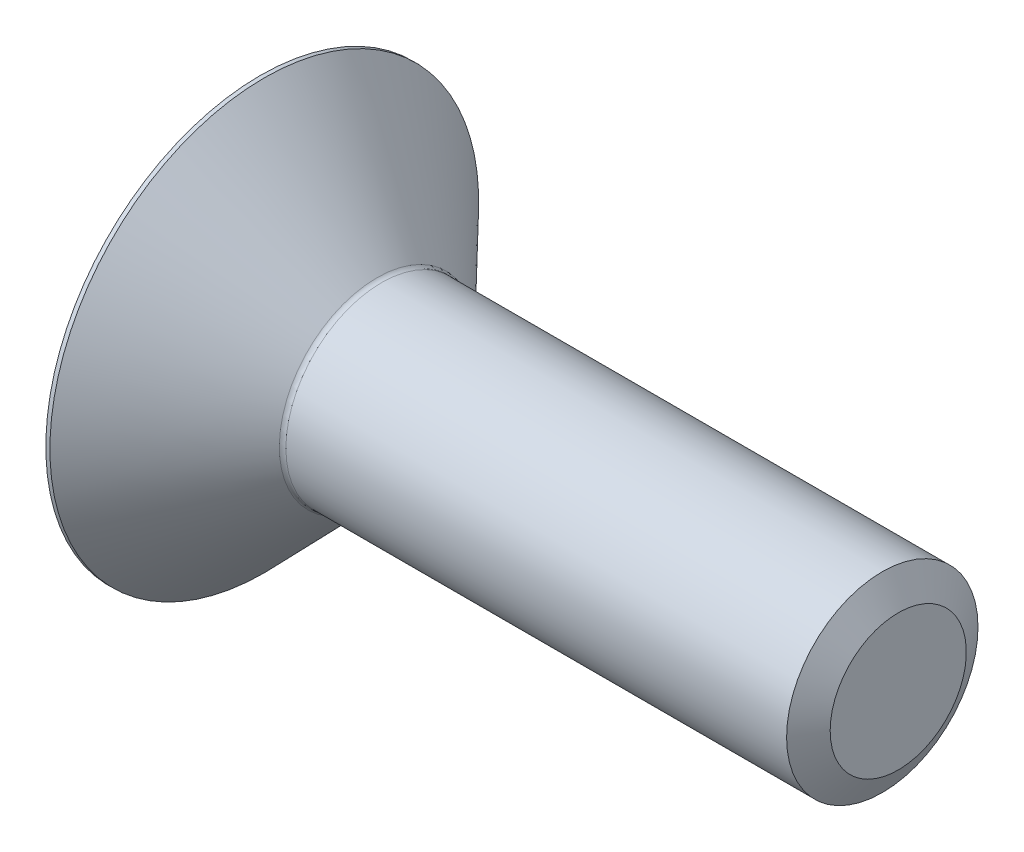
ISO-10303-21;
HEADER;
FILE_DESCRIPTION(('STEP AP214'),'2;1');
FILE_NAME('part.step','',(''),(''),'','','');
FILE_SCHEMA(('AUTOMOTIVE_DESIGN { 1 0 10303 214 1 1 1 1 }'));
ENDSEC;
DATA;
#1=APPLICATION_CONTEXT('core data for automotive mechanical design processes');
#2=APPLICATION_PROTOCOL_DEFINITION('international standard','automotive_design',2000,#1);
#3=PRODUCT_CONTEXT('',#1,'mechanical');
#4=PRODUCT('Part','Part','',(#3));
#5=PRODUCT_RELATED_PRODUCT_CATEGORY('part','',(#4));
#6=PRODUCT_DEFINITION_FORMATION('','',#4);
#7=PRODUCT_DEFINITION_CONTEXT('part definition',#1,'design');
#8=PRODUCT_DEFINITION('design','',#6,#7);
#9=PRODUCT_DEFINITION_SHAPE('','',#8);
#10=(LENGTH_UNIT() NAMED_UNIT(*) SI_UNIT(.MILLI.,.METRE.));
#11=(NAMED_UNIT(*) PLANE_ANGLE_UNIT() SI_UNIT($,.RADIAN.));
#12=(NAMED_UNIT(*) SI_UNIT($,.STERADIAN.) SOLID_ANGLE_UNIT());
#13=UNCERTAINTY_MEASURE_WITH_UNIT(LENGTH_MEASURE(1.E-05),#10,'distance_accuracy_value','');
#14=(GEOMETRIC_REPRESENTATION_CONTEXT(3) GLOBAL_UNCERTAINTY_ASSIGNED_CONTEXT((#13)) GLOBAL_UNIT_ASSIGNED_CONTEXT((#10,
#11,#12)) REPRESENTATION_CONTEXT('',''));
#15=CARTESIAN_POINT('',(0.,0.,0.));
#16=DIRECTION('',(0.,0.,1.));
#17=DIRECTION('',(1.,0.,0.));
#18=AXIS2_PLACEMENT_3D('',#15,#16,#17);
#19=CARTESIAN_POINT('',(0.,0.,0.));
#20=DIRECTION('',(1.,0.,0.));
#21=DIRECTION('',(0.,1.,0.));
#22=AXIS2_PLACEMENT_3D('',#19,#20,#21);
#23=CYLINDRICAL_SURFACE('',#22,1.5);
#24=CARTESIAN_POINT('',(-8.09755251837904,0.,0.));
#25=DIRECTION('',(1.,0.,0.));
#26=DIRECTION('',(0.,1.,0.));
#27=AXIS2_PLACEMENT_3D('',#24,#25,#26);
#28=CIRCLE('',#27,1.5);
#29=CARTESIAN_POINT('',(-8.09755251837904,1.5,0.));
#30=VERTEX_POINT('',#29);
#31=EDGE_CURVE('E102',#30,#30,#28,.T.);
#32=ORIENTED_EDGE('',*,*,#31,.T.);
#33=EDGE_LOOP('',(#32));
#34=FACE_BOUND('',#33,.T.);
#35=CARTESIAN_POINT('',(-0.25,0.,0.));
#36=DIRECTION('',(-1.,0.,0.));
#37=DIRECTION('',(0.,0.,1.));
#38=AXIS2_PLACEMENT_3D('',#35,#36,#37);
#39=CIRCLE('',#38,1.5);
#40=CARTESIAN_POINT('',(-0.25,0.,1.5));
#41=VERTEX_POINT('',#40);
#42=EDGE_CURVE('E92',#41,#41,#39,.T.);
#43=ORIENTED_EDGE('',*,*,#42,.T.);
#44=EDGE_LOOP('',(#43));
#45=FACE_BOUND('',#44,.T.);
#46=ADVANCED_FACE('F17',(#34,#45),#23,.T.);
#47=CARTESIAN_POINT('',(-10.,3.36,0.));
#48=DIRECTION('',(-1.,0.,0.));
#49=DIRECTION('',(0.,-1.,0.));
#50=AXIS2_PLACEMENT_3D('',#47,#48,#49);
#51=PLANE('',#50);
#52=CARTESIAN_POINT('',(-10.,0.,0.));
#53=DIRECTION('',(1.,0.,0.));
#54=DIRECTION('',(0.,1.,0.));
#55=AXIS2_PLACEMENT_3D('',#52,#53,#54);
#56=CIRCLE('',#55,3.36);
#57=CARTESIAN_POINT('',(-10.,3.36,0.));
#58=VERTEX_POINT('',#57);
#59=EDGE_CURVE('E198',#58,#58,#56,.T.);
#60=ORIENTED_EDGE('',*,*,#59,.F.);
#61=EDGE_LOOP('',(#60));
#62=FACE_BOUND('',#61,.T.);
#63=CARTESIAN_POINT('',(-10.,0.,0.));
#64=DIRECTION('',(-1.,0.,0.));
#65=DIRECTION('',(0.,-1.,0.));
#66=AXIS2_PLACEMENT_3D('',#63,#64,#65);
#67=CIRCLE('',#66,1.15470053837925);
#68=CARTESIAN_POINT('',(-10.,-0.577350269189631,1.));
#69=VERTEX_POINT('',#68);
#70=CARTESIAN_POINT('',(-10.,-1.15470053837925,0.));
#71=VERTEX_POINT('',#70);
#72=EDGE_CURVE('E21',#69,#71,#67,.F.);
#73=ORIENTED_EDGE('',*,*,#72,.T.);
#74=CARTESIAN_POINT('',(-10.,-0.577350269189631,-1.));
#75=VERTEX_POINT('',#74);
#76=EDGE_CURVE('E11',#71,#75,#67,.F.);
#77=ORIENTED_EDGE('',*,*,#76,.T.);
#78=CARTESIAN_POINT('',(-10.,0.577350269189625,-1.));
#79=VERTEX_POINT('',#78);
#80=EDGE_CURVE('E27',#75,#79,#67,.F.);
#81=ORIENTED_EDGE('',*,*,#80,.T.);
#82=CARTESIAN_POINT('',(-10.,1.15470053837925,0.));
#83=VERTEX_POINT('',#82);
#84=EDGE_CURVE('E93',#79,#83,#67,.F.);
#85=ORIENTED_EDGE('',*,*,#84,.T.);
#86=CARTESIAN_POINT('',(-10.,0.,0.));
#87=DIRECTION('',(-1.,0.,0.));
#88=DIRECTION('',(0.,0.,1.));
#89=AXIS2_PLACEMENT_3D('',#86,#87,#88);
#90=CIRCLE('',#89,1.15470053837925);
#91=CARTESIAN_POINT('',(-10.,0.577350269189628,1.));
#92=VERTEX_POINT('',#91);
#93=EDGE_CURVE('E76',#92,#83,#90,.T.);
#94=ORIENTED_EDGE('',*,*,#93,.F.);
#95=EDGE_CURVE('E83',#92,#69,#67,.F.);
#96=ORIENTED_EDGE('',*,*,#95,.T.);
#97=EDGE_LOOP('',(#73,#77,#81,#85,#94,#96));
#98=FACE_BOUND('',#97,.T.);
#99=ADVANCED_FACE('F95',(#62,#98),#51,.T.);
#100=CARTESIAN_POINT('',(0.,0.,0.));
#101=DIRECTION('',(1.,0.,0.));
#102=DIRECTION('',(0.,1.,0.));
#103=AXIS2_PLACEMENT_3D('',#100,#101,#102);
#104=CYLINDRICAL_SURFACE('',#103,3.36);
#105=ORIENTED_EDGE('',*,*,#59,.T.);
#106=EDGE_LOOP('',(#105));
#107=FACE_BOUND('',#106,.T.);
#108=CARTESIAN_POINT('',(-9.93618112114115,0.,0.));
#109=DIRECTION('',(1.,0.,0.));
#110=DIRECTION('',(0.,1.,0.));
#111=AXIS2_PLACEMENT_3D('',#108,#109,#110);
#112=CIRCLE('',#111,3.36);
#113=CARTESIAN_POINT('',(-9.93618112114115,3.36,0.));
#114=VERTEX_POINT('',#113);
#115=EDGE_CURVE('E196',#114,#114,#112,.T.);
#116=ORIENTED_EDGE('',*,*,#115,.F.);
#117=EDGE_LOOP('',(#116));
#118=FACE_BOUND('',#117,.T.);
#119=ADVANCED_FACE('F183',(#107,#118),#104,.T.);
#120=CARTESIAN_POINT('',(-8.16948649841291,0.,0.));
#121=DIRECTION('',(-1.,0.,0.));
#122=DIRECTION('',(0.,-1.,0.));
#123=AXIS2_PLACEMENT_3D('',#120,#121,#122);
#124=CONICAL_SURFACE('',#123,1.5305341629541,0.802851455917393);
#125=ORIENTED_EDGE('',*,*,#115,.T.);
#126=EDGE_LOOP('',(#125));
#127=FACE_BOUND('',#126,.T.);
#128=CARTESIAN_POINT('',(-8.16948649841291,0.,0.));
#129=DIRECTION('',(1.,0.,0.));
#130=DIRECTION('',(0.,1.,0.));
#131=AXIS2_PLACEMENT_3D('',#128,#129,#130);
#132=CIRCLE('',#131,1.5305341629541);
#133=CARTESIAN_POINT('',(-8.16948649841291,1.5305341629541,0.));
#134=VERTEX_POINT('',#133);
#135=EDGE_CURVE('E205',#134,#134,#132,.T.);
#136=ORIENTED_EDGE('',*,*,#135,.F.);
#137=EDGE_LOOP('',(#136));
#138=FACE_BOUND('',#137,.T.);
#139=ADVANCED_FACE('F177',(#127,#138),#124,.T.);
#140=CARTESIAN_POINT('',(-8.09755251837904,0.,0.));
#141=DIRECTION('',(1.,0.,0.));
#142=DIRECTION('',(0.,1.,0.));
#143=AXIS2_PLACEMENT_3D('',#140,#141,#142);
#144=TOROIDAL_SURFACE('',#143,1.6,0.1);
#145=ORIENTED_EDGE('',*,*,#135,.T.);
#146=EDGE_LOOP('',(#145));
#147=FACE_BOUND('',#146,.T.);
#148=ORIENTED_EDGE('',*,*,#31,.F.);
#149=EDGE_LOOP('',(#148));
#150=FACE_BOUND('',#149,.T.);
#151=ADVANCED_FACE('F175',(#147,#150),#144,.F.);
#152=CARTESIAN_POINT('',(-9.67,0.,0.));
#153=DIRECTION('',(-1.,0.,0.));
#154=DIRECTION('',(0.,0.,1.));
#155=AXIS2_PLACEMENT_3D('',#152,#153,#154);
#156=CONICAL_SURFACE('',#155,0.,1.2924281638629);
#157=CARTESIAN_POINT('',(-10.0000330049495,-0.577234799135789,1.0002));
#158=CARTESIAN_POINT('',(-9.9931767723132,-0.601209328784404,0.958674896561032));
#159=CARTESIAN_POINT('',(-9.986950249306,-0.625233209733957,0.917064314161421));
#160=CARTESIAN_POINT('',(-9.97600820198551,-0.673377505205147,0.83367594831071));
#161=CARTESIAN_POINT('',(-9.97129338172424,-0.697497959424798,0.791898096100636));
#162=CARTESIAN_POINT('',(-9.9636556441477,-0.745669161891495,0.70846312596663));
#163=CARTESIAN_POINT('',(-9.96072237456089,-0.769719488656233,0.66680673807147));
#164=CARTESIAN_POINT('',(-9.95678895886859,-0.817855017501817,0.58343355646172));
#165=CARTESIAN_POINT('',(-9.95578838324887,-0.841940210643128,0.54171677823086));
#166=CARTESIAN_POINT('',(-9.95578838324887,-0.890110596925751,0.458283221769139));
#167=CARTESIAN_POINT('',(-9.95678895886859,-0.914195790067062,0.416566443538279));
#168=CARTESIAN_POINT('',(-9.96072237456089,-0.962331318912646,0.333193261928529));
#169=CARTESIAN_POINT('',(-9.9636556441477,-0.986381645677384,0.29153687403337));
#170=CARTESIAN_POINT('',(-9.97129338172424,-1.03455284814408,0.208101903899364));
#171=CARTESIAN_POINT('',(-9.97600820198551,-1.05867330236373,0.166324051689289));
#172=CARTESIAN_POINT('',(-9.986950249306,-1.10681759783492,0.082935685838579));
#173=CARTESIAN_POINT('',(-9.9931767723132,-1.13084147878447,0.0413251034389674));
#174=CARTESIAN_POINT('',(-10.0000330049495,-1.15481600843309,-0.000200000000000344));
#175=B_SPLINE_CURVE_WITH_KNOTS('',3,(#157,#158,#159,#160,#161,#162,#163,#164,#165,#166,#167,
#168,#169,#170,#171,#172,#173,#174),.UNSPECIFIED.,.F.,.F.,(4,2,2,2,2,2,2,2,4),(0.,
0.145319064827824,0.290705711767534,0.435239252261502,0.579740668498363,0.724242084735224,
0.868775625229192,1.0141622721689,1.15948133699673),.UNSPECIFIED.);
#176=EDGE_CURVE('E109',#69,#71,#175,.T.);
#177=ORIENTED_EDGE('',*,*,#176,.T.);
#178=ORIENTED_EDGE('',*,*,#72,.F.);
#179=EDGE_LOOP('',(#177,#178));
#180=FACE_BOUND('',#179,.T.);
#181=ADVANCED_FACE('F178',(#180),#156,.F.);
#182=CARTESIAN_POINT('',(-10.1864201247989,-1.50507658562174,1.));
#183=CARTESIAN_POINT('',(-10.1756805338984,-1.45995191683151,1.));
#184=CARTESIAN_POINT('',(-10.1650772555009,-1.41479478404147,1.));
#185=CARTESIAN_POINT('',(-10.1442124650908,-1.32439927872502,1.));
#186=CARTESIAN_POINT('',(-10.1339509706694,-1.27916090214299,1.));
#187=CARTESIAN_POINT('',(-10.1037611048582,-1.14320091952673,1.));
#188=CARTESIAN_POINT('',(-10.0844526928259,-1.0523395057026,1.));
#189=CARTESIAN_POINT('',(-10.0485427680109,-0.871021733651419,1.));
#190=CARTESIAN_POINT('',(-10.0319160072656,-0.780570478060274,1.));
#191=CARTESIAN_POINT('',(-10.0024593897724,-0.599053834032337,1.));
#192=CARTESIAN_POINT('',(-9.98962864404706,-0.507988594500086,1.));
#193=CARTESIAN_POINT('',(-9.96943375174607,-0.32401701013366,1.));
#194=CARTESIAN_POINT('',(-9.96214218519738,-0.231102062710143,1.));
#195=CARTESIAN_POINT('',(-9.95667782512395,-0.0915430747170626,1.));
#196=CARTESIAN_POINT('',(-9.9557682159605,-0.0450005144934816,1.));
#197=CARTESIAN_POINT('',(-9.95580922979905,0.0480838901527621,1.));
#198=CARTESIAN_POINT('',(-9.9567598571057,0.0946257345735193,1.));
#199=CARTESIAN_POINT('',(-9.96235911230975,0.234573783926051,1.));
#200=CARTESIAN_POINT('',(-9.96977149970247,0.327875024932963,1.));
#201=CARTESIAN_POINT('',(-9.99036481799359,0.51386632785343,1.));
#202=CARTESIAN_POINT('',(-10.0035505473147,0.60655581613127,1.));
#203=CARTESIAN_POINT('',(-10.0343302733835,0.794559797027599,1.));
#204=CARTESIAN_POINT('',(-10.0520641733632,0.889850634542142,1.));
#205=CARTESIAN_POINT('',(-10.0901792888416,1.07990716554416,1.));
#206=CARTESIAN_POINT('',(-10.1105609899614,1.17467275936659,1.));
#207=CARTESIAN_POINT('',(-10.1530302070275,1.36384761434311,1.));
#208=CARTESIAN_POINT('',(-10.1751182493127,1.45825675605088,1.));
#209=CARTESIAN_POINT('',(-10.2204204884302,1.64680497415504,1.));
#210=CARTESIAN_POINT('',(-10.2436347126392,1.74094404392717,1.));
#211=CARTESIAN_POINT('',(-10.2904980732842,1.92768913293957,1.));
#212=CARTESIAN_POINT('',(-10.314136313184,2.02029789764918,1.));
#213=CARTESIAN_POINT('',(-10.3619465911489,2.20537976707471,1.));
#214=CARTESIAN_POINT('',(-10.3861186431025,2.2978528681941,1.));
#215=CARTESIAN_POINT('',(-10.4348136295748,2.48255351818147,1.));
#216=CARTESIAN_POINT('',(-10.4593359637595,2.57478122564271,1.));
#217=CARTESIAN_POINT('',(-10.5086763218414,2.75915354563859,1.));
#218=CARTESIAN_POINT('',(-10.5334943336762,2.8512981613992,1.));
#219=CARTESIAN_POINT('',(-10.5584153528749,2.94341459729474,1.));
#220=B_SPLINE_CURVE_WITH_KNOTS('',3,(#182,#183,#184,#185,#186,#187,#188,#189,#190,#191,#192,
#193,#194,#195,#196,#197,#198,#199,#200,#201,#202,#203,#204,#205,#206,#207,#208,#209,#210,#211,
#212,#213,#214,#215,#216,#217,#218,#219),.UNSPECIFIED.,.F.,.F.,(4,2,2,2,2,2,2,2,2,2,2,2,2,2,2,2,
2,2,4),(0.,0.139154753232827,0.278316657587891,0.55696460448012,0.832812881766319,
1.10859650773445,1.38793420964473,1.52755398880046,1.66717409104072,1.94769382621527,
2.22844715485888,2.519169414303,2.80994506926727,3.10081077796332,3.39168356097394,
3.67841536084619,3.96515462957441,4.25145053495921,4.53773480030589),.UNSPECIFIED.);
#221=EDGE_CURVE('E82',#92,#69,#220,.F.);
#222=ORIENTED_EDGE('',*,*,#221,.T.);
#223=ORIENTED_EDGE('',*,*,#95,.F.);
#224=EDGE_LOOP('',(#222,#223));
#225=FACE_BOUND('',#224,.T.);
#226=ADVANCED_FACE('F88',(#225),#156,.F.);
#227=CARTESIAN_POINT('',(-10.0000330049495,1.15481600843309,-0.000199999999999794));
#228=CARTESIAN_POINT('',(-9.9931767723132,1.13084147878447,0.041325103438968));
#229=CARTESIAN_POINT('',(-9.986950249306,1.10681759783492,0.0829356858385795));
#230=CARTESIAN_POINT('',(-9.97600820198551,1.05867330236373,0.16632405168929));
#231=CARTESIAN_POINT('',(-9.97129338172424,1.03455284814408,0.208101903899364));
#232=CARTESIAN_POINT('',(-9.9636556441477,0.986381645677382,0.29153687403337));
#233=CARTESIAN_POINT('',(-9.96072237456089,0.962331318912644,0.33319326192853));
#234=CARTESIAN_POINT('',(-9.95678895886859,0.91419579006706,0.416566443538279));
#235=CARTESIAN_POINT('',(-9.95578838324887,0.890110596925749,0.45828322176914));
#236=CARTESIAN_POINT('',(-9.95578838324887,0.841940210643127,0.54171677823086));
#237=CARTESIAN_POINT('',(-9.95678895886859,0.817855017501815,0.583433556461721));
#238=CARTESIAN_POINT('',(-9.96072237456089,0.769719488656231,0.66680673807147));
#239=CARTESIAN_POINT('',(-9.9636556441477,0.745669161891493,0.70846312596663));
#240=CARTESIAN_POINT('',(-9.97129338172424,0.697497959424796,0.791898096100636));
#241=CARTESIAN_POINT('',(-9.97600820198551,0.673377505205146,0.83367594831071));
#242=CARTESIAN_POINT('',(-9.986950249306,0.625233209733955,0.917064314161421));
#243=CARTESIAN_POINT('',(-9.9931767723132,0.601209328784402,0.958674896561032));
#244=CARTESIAN_POINT('',(-10.0000330049495,0.577234799135787,1.0002));
#245=B_SPLINE_CURVE_WITH_KNOTS('',3,(#227,#228,#229,#230,#231,#232,#233,#234,#235,#236,#237,
#238,#239,#240,#241,#242,#243,#244),.UNSPECIFIED.,.F.,.F.,(4,2,2,2,2,2,2,2,4),(0.,
0.145319064827824,0.290705711767533,0.435239252261501,0.579740668498363,0.724242084735224,
0.868775625229192,1.0141622721689,1.15948133699673),.UNSPECIFIED.);
#246=EDGE_CURVE('E71',#83,#92,#245,.T.);
#247=ORIENTED_EDGE('',*,*,#246,.T.);
#248=ORIENTED_EDGE('',*,*,#93,.T.);
#249=EDGE_LOOP('',(#247,#248));
#250=FACE_BOUND('',#249,.T.);
#251=ADVANCED_FACE('F72',(#250),#156,.F.);
#252=CARTESIAN_POINT('',(-10.0000330049495,0.577234799135787,-1.0002));
#253=CARTESIAN_POINT('',(-9.9931767723132,0.601209328784402,-0.958674896561032));
#254=CARTESIAN_POINT('',(-9.986950249306,0.625233209733954,-0.917064314161421));
#255=CARTESIAN_POINT('',(-9.97600820198551,0.673377505205145,-0.83367594831071));
#256=CARTESIAN_POINT('',(-9.97129338172424,0.697497959424796,-0.791898096100636));
#257=CARTESIAN_POINT('',(-9.9636556441477,0.745669161891492,-0.70846312596663));
#258=CARTESIAN_POINT('',(-9.96072237456089,0.76971948865623,-0.66680673807147));
#259=CARTESIAN_POINT('',(-9.95678895886859,0.817855017501815,-0.58343355646172));
#260=CARTESIAN_POINT('',(-9.95578838324887,0.841940210643126,-0.54171677823086));
#261=CARTESIAN_POINT('',(-9.95578838324887,0.890110596925748,-0.458283221769139));
#262=CARTESIAN_POINT('',(-9.95678895886859,0.914195790067059,-0.416566443538279));
#263=CARTESIAN_POINT('',(-9.96072237456089,0.962331318912644,-0.33319326192853));
#264=CARTESIAN_POINT('',(-9.9636556441477,0.986381645677382,-0.29153687403337));
#265=CARTESIAN_POINT('',(-9.97129338172424,1.03455284814408,-0.208101903899364));
#266=CARTESIAN_POINT('',(-9.97600820198551,1.05867330236373,-0.166324051689289));
#267=CARTESIAN_POINT('',(-9.986950249306,1.10681759783492,-0.0829356858385789));
#268=CARTESIAN_POINT('',(-9.9931767723132,1.13084147878447,-0.0413251034389675));
#269=CARTESIAN_POINT('',(-10.0000330049495,1.15481600843309,0.000199999999999984));
#270=B_SPLINE_CURVE_WITH_KNOTS('',3,(#252,#253,#254,#255,#256,#257,#258,#259,#260,#261,#262,
#263,#264,#265,#266,#267,#268,#269),.UNSPECIFIED.,.F.,.F.,(4,2,2,2,2,2,2,2,4),(0.,
0.145319064827824,0.290705711767533,0.435239252261502,0.579740668498363,0.724242084735224,
0.868775625229192,1.0141622721689,1.15948133699673),.UNSPECIFIED.);
#271=EDGE_CURVE('E94',#79,#83,#270,.T.);
#272=ORIENTED_EDGE('',*,*,#271,.T.);
#273=ORIENTED_EDGE('',*,*,#84,.F.);
#274=EDGE_LOOP('',(#272,#273));
#275=FACE_BOUND('',#274,.T.);
#276=ADVANCED_FACE('F276',(#275),#156,.F.);
#277=CARTESIAN_POINT('',(-10.1864201247989,-1.50507658562174,-1.));
#278=CARTESIAN_POINT('',(-10.1756805338984,-1.45995191683151,-1.));
#279=CARTESIAN_POINT('',(-10.1650772555009,-1.41479478404147,-1.));
#280=CARTESIAN_POINT('',(-10.1442124650908,-1.32439927872502,-1.));
#281=CARTESIAN_POINT('',(-10.1339509706694,-1.27916090214299,-1.));
#282=CARTESIAN_POINT('',(-10.1037611048582,-1.14320091952673,-1.));
#283=CARTESIAN_POINT('',(-10.0844526928259,-1.0523395057026,-1.));
#284=CARTESIAN_POINT('',(-10.0485427680109,-0.871021733651419,-1.));
#285=CARTESIAN_POINT('',(-10.0319160072656,-0.780570478060274,-1.));
#286=CARTESIAN_POINT('',(-10.0024593897724,-0.599053834032337,-1.));
#287=CARTESIAN_POINT('',(-9.98962864404706,-0.507988594500086,-1.));
#288=CARTESIAN_POINT('',(-9.96943375174607,-0.32401701013366,-1.));
#289=CARTESIAN_POINT('',(-9.96214218519738,-0.231102062710143,-1.));
#290=CARTESIAN_POINT('',(-9.95667782512395,-0.0915430747170626,-1.));
#291=CARTESIAN_POINT('',(-9.9557682159605,-0.0450005144934816,-1.));
#292=CARTESIAN_POINT('',(-9.95580922979905,0.0480838901527621,-1.));
#293=CARTESIAN_POINT('',(-9.9567598571057,0.0946257345735193,-1.));
#294=CARTESIAN_POINT('',(-9.96235911230975,0.234573783926051,-1.));
#295=CARTESIAN_POINT('',(-9.96977149970247,0.327875024932963,-1.));
#296=CARTESIAN_POINT('',(-9.99036481799359,0.51386632785343,-1.));
#297=CARTESIAN_POINT('',(-10.0035505473147,0.60655581613127,-1.));
#298=CARTESIAN_POINT('',(-10.0343302733835,0.794559797027599,-1.));
#299=CARTESIAN_POINT('',(-10.0520641733632,0.889850634542142,-1.));
#300=CARTESIAN_POINT('',(-10.0901792888416,1.07990716554416,-1.));
#301=CARTESIAN_POINT('',(-10.1105609899614,1.17467275936659,-1.));
#302=CARTESIAN_POINT('',(-10.1530302070275,1.36384761434311,-1.));
#303=CARTESIAN_POINT('',(-10.1751182493127,1.45825675605088,-1.));
#304=CARTESIAN_POINT('',(-10.2204204884302,1.64680497415504,-1.));
#305=CARTESIAN_POINT('',(-10.2436347126392,1.74094404392717,-1.));
#306=CARTESIAN_POINT('',(-10.2904980732842,1.92768913293957,-1.));
#307=CARTESIAN_POINT('',(-10.314136313184,2.02029789764918,-1.));
#308=CARTESIAN_POINT('',(-10.3619465911489,2.20537976707471,-1.));
#309=CARTESIAN_POINT('',(-10.3861186431025,2.2978528681941,-1.));
#310=CARTESIAN_POINT('',(-10.4348136295748,2.48255351818147,-1.));
#311=CARTESIAN_POINT('',(-10.4593359637595,2.57478122564271,-1.));
#312=CARTESIAN_POINT('',(-10.5086763218414,2.75915354563859,-1.));
#313=CARTESIAN_POINT('',(-10.5334943336762,2.8512981613992,-1.));
#314=CARTESIAN_POINT('',(-10.5584153528749,2.94341459729474,-1.));
#315=B_SPLINE_CURVE_WITH_KNOTS('',3,(#277,#278,#279,#280,#281,#282,#283,#284,#285,#286,#287,
#288,#289,#290,#291,#292,#293,#294,#295,#296,#297,#298,#299,#300,#301,#302,#303,#304,#305,#306,
#307,#308,#309,#310,#311,#312,#313,#314),.UNSPECIFIED.,.F.,.F.,(4,2,2,2,2,2,2,2,2,2,2,2,2,2,2,2,
2,2,4),(0.,0.139154753232827,0.278316657587891,0.55696460448012,0.832812881766319,
1.10859650773445,1.38793420964473,1.52755398880046,1.66717409104072,1.94769382621527,
2.22844715485888,2.519169414303,2.80994506926727,3.10081077796332,3.39168356097394,
3.67841536084619,3.96515462957441,4.25145053495921,4.53773480030589),.UNSPECIFIED.);
#316=EDGE_CURVE('E235',#75,#79,#315,.T.);
#317=ORIENTED_EDGE('',*,*,#316,.T.);
#318=ORIENTED_EDGE('',*,*,#80,.F.);
#319=EDGE_LOOP('',(#317,#318));
#320=FACE_BOUND('',#319,.T.);
#321=ADVANCED_FACE('F262',(#320),#156,.F.);
#322=CARTESIAN_POINT('',(-10.0000330049495,-1.15481600843309,0.000199999999999855));
#323=CARTESIAN_POINT('',(-9.9931767723132,-1.13084147878448,-0.0413251034389682));
#324=CARTESIAN_POINT('',(-9.986950249306,-1.10681759783492,-0.0829356858385799));
#325=CARTESIAN_POINT('',(-9.97600820198551,-1.05867330236373,-0.16632405168929));
#326=CARTESIAN_POINT('',(-9.97129338172424,-1.03455284814408,-0.208101903899364));
#327=CARTESIAN_POINT('',(-9.9636556441477,-0.986381645677385,-0.29153687403337));
#328=CARTESIAN_POINT('',(-9.96072237456089,-0.962331318912647,-0.33319326192853));
#329=CARTESIAN_POINT('',(-9.95678895886859,-0.914195790067063,-0.41656644353828));
#330=CARTESIAN_POINT('',(-9.95578838324887,-0.890110596925751,-0.45828322176914));
#331=CARTESIAN_POINT('',(-9.95578838324887,-0.841940210643129,-0.541716778230861));
#332=CARTESIAN_POINT('',(-9.95678895886859,-0.817855017501818,-0.583433556461721));
#333=CARTESIAN_POINT('',(-9.96072237456089,-0.769719488656233,-0.66680673807147));
#334=CARTESIAN_POINT('',(-9.9636556441477,-0.745669161891495,-0.70846312596663));
#335=CARTESIAN_POINT('',(-9.97129338172424,-0.697497959424799,-0.791898096100636));
#336=CARTESIAN_POINT('',(-9.97600820198551,-0.673377505205148,-0.83367594831071));
#337=CARTESIAN_POINT('',(-9.986950249306,-0.625233209733957,-0.917064314161421));
#338=CARTESIAN_POINT('',(-9.9931767723132,-0.601209328784404,-0.958674896561032));
#339=CARTESIAN_POINT('',(-10.0000330049495,-0.577234799135789,-1.0002));
#340=B_SPLINE_CURVE_WITH_KNOTS('',3,(#322,#323,#324,#325,#326,#327,#328,#329,#330,#331,#332,
#333,#334,#335,#336,#337,#338,#339),.UNSPECIFIED.,.F.,.F.,(4,2,2,2,2,2,2,2,4),(0.,
0.145319064827824,0.290705711767533,0.435239252261501,0.579740668498363,0.724242084735224,
0.868775625229192,1.0141622721689,1.15948133699673),.UNSPECIFIED.);
#341=EDGE_CURVE('E115',#71,#75,#340,.T.);
#342=ORIENTED_EDGE('',*,*,#341,.T.);
#343=ORIENTED_EDGE('',*,*,#76,.F.);
#344=EDGE_LOOP('',(#342,#343));
#345=FACE_BOUND('',#344,.T.);
#346=ADVANCED_FACE('F270',(#345),#156,.F.);
#347=CARTESIAN_POINT('',(-8.9,0.,0.));
#348=DIRECTION('',(-1.,0.,0.));
#349=DIRECTION('',(0.,0.,1.));
#350=AXIS2_PLACEMENT_3D('',#347,#348,#349);
#351=CONICAL_SURFACE('',#350,1.15470053837925,1.0471975511966);
#352=CARTESIAN_POINT('',(-8.23333333333334,0.,0.));
#353=VERTEX_POINT('',#352);
#354=VERTEX_LOOP('',#353);
#355=FACE_BOUND('',#354,.T.);
#356=CARTESIAN_POINT('',(-9.27183528873947,-1.49514512143373,1.));
#357=CARTESIAN_POINT('',(-9.25111502079343,-1.45196126115329,1.));
#358=CARTESIAN_POINT('',(-9.23061367234947,-1.40867282404236,1.));
#359=CARTESIAN_POINT('',(-9.1901634335246,-1.32182947914247,1.));
#360=CARTESIAN_POINT('',(-9.17021464256729,-1.27827452509755,1.));
#361=CARTESIAN_POINT('',(-9.11114515483649,-1.14662339890625,1.));
#362=CARTESIAN_POINT('',(-9.07305252653304,-1.05805724149108,1.));
#363=CARTESIAN_POINT('',(-9.00024582070058,-0.876833003172496,1.));
#364=CARTESIAN_POINT('',(-8.96564584045392,-0.784128452056496,1.));
#365=CARTESIAN_POINT('',(-8.90407347381846,-0.596331746532131,1.));
#366=CARTESIAN_POINT('',(-8.87708128484786,-0.501246505541257,1.));
#367=CARTESIAN_POINT('',(-8.84577577003502,-0.356699986452704,1.));
#368=CARTESIAN_POINT('',(-8.83687509854699,-0.30824416317171,1.));
#369=CARTESIAN_POINT('',(-8.82274243175691,-0.210788870695444,1.));
#370=CARTESIAN_POINT('',(-8.81751018853518,-0.161789438465743,1.));
#371=CARTESIAN_POINT('',(-8.81119898098177,-0.0641060489970672,1.));
#372=CARTESIAN_POINT('',(-8.81007100501111,-0.0154253461269781,1.));
#373=CARTESIAN_POINT('',(-8.81193297830514,0.0818553564032744,1.));
#374=CARTESIAN_POINT('',(-8.81492318255362,0.130455350879701,1.));
#375=CARTESIAN_POINT('',(-8.82711832172931,0.250369589613777,1.));
#376=CARTESIAN_POINT('',(-8.83860856098489,0.321451919115026,1.));
#377=CARTESIAN_POINT('',(-8.86824031739763,0.462229038490166,1.));
#378=CARTESIAN_POINT('',(-8.88638985094493,0.531922048861731,1.));
#379=CARTESIAN_POINT('',(-8.92786972268665,0.671415729806803,1.));
#380=CARTESIAN_POINT('',(-8.95130716830693,0.741183729418067,1.));
#381=CARTESIAN_POINT('',(-9.00156448824641,0.879438319396284,1.));
#382=CARTESIAN_POINT('',(-9.02838317523047,0.947925349932555,1.));
#383=CARTESIAN_POINT('',(-9.1000539154734,1.12214515906644,1.));
#384=CARTESIAN_POINT('',(-9.14657230519899,1.22718574040677,1.));
#385=CARTESIAN_POINT('',(-9.24287692224798,1.43575968104558,1.));
#386=CARTESIAN_POINT('',(-9.29266398782224,1.53929264533347,1.));
#387=CARTESIAN_POINT('',(-9.39433644453464,1.74546702338821,1.));
#388=CARTESIAN_POINT('',(-9.44622418186697,1.84810727553998,1.));
#389=CARTESIAN_POINT('',(-9.55133836883522,2.05270058021726,1.));
#390=CARTESIAN_POINT('',(-9.60456486267233,2.15465360991172,1.));
#391=CARTESIAN_POINT('',(-9.7068669169112,2.34846553091283,1.));
#392=CARTESIAN_POINT('',(-9.75585965896404,2.4403682316157,1.));
#393=CARTESIAN_POINT('',(-9.85440313282821,2.62387799005299,1.));
#394=CARTESIAN_POINT('',(-9.90395388528949,2.71548503668386,1.));
#395=CARTESIAN_POINT('',(-10.0033471076798,2.89823865557592,1.));
#396=CARTESIAN_POINT('',(-10.053188515041,2.98938580641154,1.));
#397=CARTESIAN_POINT('',(-10.1531957233761,3.17149583112621,1.));
#398=CARTESIAN_POINT('',(-10.2033615072371,3.26245871439934,1.));
#399=CARTESIAN_POINT('',(-10.253646212205,3.35335539208175,1.));
#400=B_SPLINE_CURVE_WITH_KNOTS('',3,(#356,#357,#358,#359,#360,#361,#362,#363,#364,#365,#366,
#367,#368,#369,#370,#371,#372,#373,#374,#375,#376,#377,#378,#379,#380,#381,#382,#383,#384,#385,
#386,#387,#388,#389,#390,#391,#392,#393,#394,#395,#396,#397,#398,#399),.UNSPECIFIED.,.F.,.F.,(4,
2,2,2,2,2,2,2,2,2,2,2,2,2,2,2,2,2,2,2,2,4),(0.,0.143690341820649,0.287406372566272,
0.576560332877488,0.873259488934025,1.16917907000005,1.31686338831956,1.46453772487642,
1.61044269221658,1.75635669390451,1.97192533331897,2.18775432802312,2.40842600301164,
2.62902040304934,2.97355048126457,3.31816926186282,3.6631841739513,4.00821049225241,
4.32064609598595,4.63309330006987,4.94474578248759,5.2563819552864),.UNSPECIFIED.);
#401=CARTESIAN_POINT('',(-8.9,-0.577350269189627,1.));
#402=VERTEX_POINT('',#401);
#403=CARTESIAN_POINT('',(-8.9,0.577350269189625,1.));
#404=VERTEX_POINT('',#403);
#405=EDGE_CURVE('E145',#402,#404,#400,.T.);
#406=ORIENTED_EDGE('',*,*,#405,.T.);
#407=CARTESIAN_POINT('',(-8.90006667666567,0.577234799135787,1.0002));
#408=CARTESIAN_POINT('',(-8.88540897364915,0.602607795820546,0.95625268060172));
#409=CARTESIAN_POINT('',(-8.8720777236209,0.628199807531656,0.91192601605018));
#410=CARTESIAN_POINT('',(-8.84880650762346,0.67982709833083,0.822504925328879));
#411=CARTESIAN_POINT('',(-8.83887477654978,0.705863295614157,0.777408908798269));
#412=CARTESIAN_POINT('',(-8.82341269488208,0.757612978088367,0.687775829477381));
#413=CARTESIAN_POINT('',(-8.81777946809895,0.783318495222182,0.643252567766781));
#414=CARTESIAN_POINT('',(-8.81105128864025,0.83485064837367,0.553996260284983));
#415=CARTESIAN_POINT('',(-8.80995076792166,0.86067709674978,0.509263539518506));
#416=CARTESIAN_POINT('',(-8.81222505229814,0.908946264126689,0.425658889182654));
#417=CARTESIAN_POINT('',(-8.81504143886341,0.931396163287556,0.386774523211234));
#418=CARTESIAN_POINT('',(-8.82397245021735,0.976149681982092,0.309259155014814));
#419=CARTESIAN_POINT('',(-8.8300901337543,0.998453146411449,0.270628421438361));
#420=CARTESIAN_POINT('',(-8.84538572572582,1.04329913914046,0.192952883515855));
#421=CARTESIAN_POINT('',(-8.85462855216896,1.0658359836813,0.153917923728832));
#422=CARTESIAN_POINT('',(-8.87560684575553,1.11057330008463,0.0764306187239877));
#423=CARTESIAN_POINT('',(-8.88733737513366,1.13277434629517,0.0379772787061406));
#424=CARTESIAN_POINT('',(-8.90006667666567,1.15481600843309,-0.00019999999999974));
#425=B_SPLINE_CURVE_WITH_KNOTS('',3,(#407,#408,#409,#410,#411,#412,#413,#414,#415,#416,#417,
#418,#419,#420,#421,#422,#423,#424),.UNSPECIFIED.,.F.,.F.,(4,2,2,2,2,2,2,2,4),(0.,
0.158523820030115,0.317428970089343,0.472400167924634,0.627180939971649,0.762016584872711,
0.896977373984233,1.03493410168667,1.17261952416172),.UNSPECIFIED.);
#426=CARTESIAN_POINT('',(-8.9,1.15470053837925,0.));
#427=VERTEX_POINT('',#426);
#428=EDGE_CURVE('E101',#404,#427,#425,.T.);
#429=ORIENTED_EDGE('',*,*,#428,.T.);
#430=CARTESIAN_POINT('',(-8.90006667666567,1.15481600843309,0.000200000000000205));
#431=CARTESIAN_POINT('',(-8.88540897364915,1.12944301174833,-0.0437473193982794));
#432=CARTESIAN_POINT('',(-8.8720777236209,1.10385100003722,-0.0880739839498198));
#433=CARTESIAN_POINT('',(-8.84880650762345,1.05222370923805,-0.177495074671121));
#434=CARTESIAN_POINT('',(-8.83887477654978,1.02618751195472,-0.222591091201731));
#435=CARTESIAN_POINT('',(-8.82341269488208,0.974437829480509,-0.312224170522618));
#436=CARTESIAN_POINT('',(-8.81777946809895,0.948732312346693,-0.356747432233219));
#437=CARTESIAN_POINT('',(-8.81105128864025,0.897200159195205,-0.446003739715017));
#438=CARTESIAN_POINT('',(-8.80995076792166,0.871373710819096,-0.490736460481494));
#439=CARTESIAN_POINT('',(-8.81222505229814,0.823104543442187,-0.574341110817346));
#440=CARTESIAN_POINT('',(-8.81504143886341,0.800654644281319,-0.613225476788766));
#441=CARTESIAN_POINT('',(-8.82397245021735,0.755901125586783,-0.690740844985186));
#442=CARTESIAN_POINT('',(-8.8300901337543,0.733597661157425,-0.729371578561639));
#443=CARTESIAN_POINT('',(-8.84538572572582,0.688751668428418,-0.807047116484145));
#444=CARTESIAN_POINT('',(-8.85462855216896,0.666214823887574,-0.846082076271168));
#445=CARTESIAN_POINT('',(-8.87560684575553,0.621477507484248,-0.923569381276012));
#446=CARTESIAN_POINT('',(-8.88733737513366,0.599276461273704,-0.962022721293859));
#447=CARTESIAN_POINT('',(-8.90006667666567,0.577234799135787,-1.0002));
#448=B_SPLINE_CURVE_WITH_KNOTS('',3,(#430,#431,#432,#433,#434,#435,#436,#437,#438,#439,#440,
#441,#442,#443,#444,#445,#446,#447),.UNSPECIFIED.,.F.,.F.,(4,2,2,2,2,2,2,2,4),(0.,
0.158523820030116,0.317428970089343,0.472400167924634,0.627180939971649,0.762016584872712,
0.896977373984234,1.03493410168667,1.17261952416172),.UNSPECIFIED.);
#449=CARTESIAN_POINT('',(-8.9,0.577350269189626,-1.));
#450=VERTEX_POINT('',#449);
#451=EDGE_CURVE('E197',#427,#450,#448,.T.);
#452=ORIENTED_EDGE('',*,*,#451,.T.);
#453=CARTESIAN_POINT('',(-9.27183528873947,-1.49514512143373,-1.));
#454=CARTESIAN_POINT('',(-9.25111502079343,-1.45196126115329,-1.));
#455=CARTESIAN_POINT('',(-9.23061367234947,-1.40867282404236,-1.));
#456=CARTESIAN_POINT('',(-9.1901634335246,-1.32182947914247,-1.));
#457=CARTESIAN_POINT('',(-9.17021464256729,-1.27827452509755,-1.));
#458=CARTESIAN_POINT('',(-9.11114515483649,-1.14662339890625,-1.));
#459=CARTESIAN_POINT('',(-9.07305252653304,-1.05805724149108,-1.));
#460=CARTESIAN_POINT('',(-9.00024582070058,-0.876833003172495,-1.));
#461=CARTESIAN_POINT('',(-8.96564584045392,-0.784128452056495,-1.));
#462=CARTESIAN_POINT('',(-8.90407347381846,-0.596331746532131,-1.));
#463=CARTESIAN_POINT('',(-8.87708128484786,-0.501246505541256,-1.));
#464=CARTESIAN_POINT('',(-8.84577577003502,-0.356699986452704,-1.));
#465=CARTESIAN_POINT('',(-8.83687509854699,-0.30824416317171,-1.));
#466=CARTESIAN_POINT('',(-8.82274243175691,-0.210788870695444,-1.));
#467=CARTESIAN_POINT('',(-8.81751018853518,-0.161789438465743,-1.));
#468=CARTESIAN_POINT('',(-8.81119898098177,-0.0641060489970669,-1.));
#469=CARTESIAN_POINT('',(-8.81007100501111,-0.0154253461269777,-1.));
#470=CARTESIAN_POINT('',(-8.81193297830514,0.0818553564032746,-1.));
#471=CARTESIAN_POINT('',(-8.81492318255362,0.130455350879701,-1.));
#472=CARTESIAN_POINT('',(-8.82711832172931,0.250369589613777,-1.));
#473=CARTESIAN_POINT('',(-8.83860856098489,0.321451919115026,-1.));
#474=CARTESIAN_POINT('',(-8.86824031739763,0.462229038490166,-1.));
#475=CARTESIAN_POINT('',(-8.88638985094493,0.531922048861731,-1.));
#476=CARTESIAN_POINT('',(-8.92786972268665,0.671415729806803,-1.));
#477=CARTESIAN_POINT('',(-8.95130716830693,0.741183729418067,-1.));
#478=CARTESIAN_POINT('',(-9.00156448824641,0.879438319396284,-1.));
#479=CARTESIAN_POINT('',(-9.02838317523047,0.947925349932555,-1.));
#480=CARTESIAN_POINT('',(-9.1000539154734,1.12214515906644,-1.));
#481=CARTESIAN_POINT('',(-9.14657230519899,1.22718574040677,-1.));
#482=CARTESIAN_POINT('',(-9.24287692224798,1.43575968104557,-1.));
#483=CARTESIAN_POINT('',(-9.29266398782224,1.53929264533347,-1.));
#484=CARTESIAN_POINT('',(-9.39433644453464,1.74546702338821,-1.));
#485=CARTESIAN_POINT('',(-9.44622418186697,1.84810727553998,-1.));
#486=CARTESIAN_POINT('',(-9.55133836883522,2.05270058021726,-1.));
#487=CARTESIAN_POINT('',(-9.60456486267233,2.15465360991172,-1.));
#488=CARTESIAN_POINT('',(-9.7068669169112,2.34846553091283,-1.));
#489=CARTESIAN_POINT('',(-9.75585965896404,2.4403682316157,-1.));
#490=CARTESIAN_POINT('',(-9.85440313282821,2.623877990053,-1.));
#491=CARTESIAN_POINT('',(-9.90395388528949,2.71548503668386,-1.));
#492=CARTESIAN_POINT('',(-10.0033471076798,2.89823865557592,-1.));
#493=CARTESIAN_POINT('',(-10.053188515041,2.98938580641154,-1.));
#494=CARTESIAN_POINT('',(-10.1531957233761,3.17149583112621,-1.));
#495=CARTESIAN_POINT('',(-10.2033615072371,3.26245871439934,-1.));
#496=CARTESIAN_POINT('',(-10.253646212205,3.35335539208175,-1.));
#497=B_SPLINE_CURVE_WITH_KNOTS('',3,(#453,#454,#455,#456,#457,#458,#459,#460,#461,#462,#463,
#464,#465,#466,#467,#468,#469,#470,#471,#472,#473,#474,#475,#476,#477,#478,#479,#480,#481,#482,
#483,#484,#485,#486,#487,#488,#489,#490,#491,#492,#493,#494,#495,#496),.UNSPECIFIED.,.F.,.F.,(4,
2,2,2,2,2,2,2,2,2,2,2,2,2,2,2,2,2,2,2,2,4),(0.,0.143690341820649,0.287406372566272,
0.576560332877488,0.873259488934026,1.16917907000005,1.31686338831956,1.46453772487642,
1.61044269221658,1.75635669390451,1.97192533331897,2.18775432802312,2.40842600301164,
2.62902040304934,2.97355048126457,3.31816926186282,3.6631841739513,4.00821049225241,
4.32064609598595,4.63309330006987,4.9447457824876,5.2563819552864),.UNSPECIFIED.);
#498=CARTESIAN_POINT('',(-8.9,-0.577350269189627,-1.));
#499=VERTEX_POINT('',#498);
#500=EDGE_CURVE('E79',#450,#499,#497,.F.);
#501=ORIENTED_EDGE('',*,*,#500,.T.);
#502=CARTESIAN_POINT('',(-8.90006667666567,-0.577234799135789,-1.0002));
#503=CARTESIAN_POINT('',(-8.88540897364915,-0.602607795820548,-0.95625268060172));
#504=CARTESIAN_POINT('',(-8.8720777236209,-0.628199807531659,-0.91192601605018));
#505=CARTESIAN_POINT('',(-8.84880650762346,-0.679827098330832,-0.822504925328878));
#506=CARTESIAN_POINT('',(-8.83887477654978,-0.70586329561416,-0.777408908798268));
#507=CARTESIAN_POINT('',(-8.82341269488208,-0.757612978088369,-0.687775829477381));
#508=CARTESIAN_POINT('',(-8.81777946809895,-0.783318495222185,-0.64325256776678));
#509=CARTESIAN_POINT('',(-8.81105128864025,-0.834850648373673,-0.553996260284982));
#510=CARTESIAN_POINT('',(-8.80995076792166,-0.860677096749782,-0.509263539518505));
#511=CARTESIAN_POINT('',(-8.81222505229814,-0.908946264126691,-0.425658889182653));
#512=CARTESIAN_POINT('',(-8.81504143886341,-0.931396163287558,-0.386774523211233));
#513=CARTESIAN_POINT('',(-8.82397245021735,-0.976149681982094,-0.309259155014814));
#514=CARTESIAN_POINT('',(-8.8300901337543,-0.998453146411452,-0.270628421438361));
#515=CARTESIAN_POINT('',(-8.84538572572583,-1.04329913914046,-0.192952883515855));
#516=CARTESIAN_POINT('',(-8.85462855216896,-1.0658359836813,-0.153917923728832));
#517=CARTESIAN_POINT('',(-8.87560684575553,-1.11057330008463,-0.0764306187239879));
#518=CARTESIAN_POINT('',(-8.88733737513366,-1.13277434629517,-0.0379772787061409));
#519=CARTESIAN_POINT('',(-8.90006667666567,-1.15481600843309,0.000199999999999766));
#520=B_SPLINE_CURVE_WITH_KNOTS('',3,(#502,#503,#504,#505,#506,#507,#508,#509,#510,#511,#512,
#513,#514,#515,#516,#517,#518,#519),.UNSPECIFIED.,.F.,.F.,(4,2,2,2,2,2,2,2,4),(0.,
0.158523820030116,0.317428970089344,0.472400167924635,0.627180939971649,0.762016584872712,
0.896977373984233,1.03493410168667,1.17261952416172),.UNSPECIFIED.);
#521=CARTESIAN_POINT('',(-8.9,-1.15470053837925,0.));
#522=VERTEX_POINT('',#521);
#523=EDGE_CURVE('E246',#499,#522,#520,.T.);
#524=ORIENTED_EDGE('',*,*,#523,.T.);
#525=CARTESIAN_POINT('',(-8.90006667666567,-1.15481600843309,-0.00020000000000017));
#526=CARTESIAN_POINT('',(-8.88540897364915,-1.12944301174833,0.0437473193982795));
#527=CARTESIAN_POINT('',(-8.8720777236209,-1.10385100003722,0.0880739839498199));
#528=CARTESIAN_POINT('',(-8.84880650762346,-1.05222370923805,0.177495074671122));
#529=CARTESIAN_POINT('',(-8.83887477654978,-1.02618751195472,0.222591091201731));
#530=CARTESIAN_POINT('',(-8.82341269488208,-0.97443782948051,0.312224170522619));
#531=CARTESIAN_POINT('',(-8.81777946809895,-0.948732312346695,0.35674743223322));
#532=CARTESIAN_POINT('',(-8.81105128864025,-0.897200159195207,0.446003739715018));
#533=CARTESIAN_POINT('',(-8.80995076792166,-0.871373710819098,0.490736460481495));
#534=CARTESIAN_POINT('',(-8.81222505229814,-0.823104543442189,0.574341110817347));
#535=CARTESIAN_POINT('',(-8.81504143886341,-0.800654644281321,0.613225476788767));
#536=CARTESIAN_POINT('',(-8.82397245021735,-0.755901125586785,0.690740844985186));
#537=CARTESIAN_POINT('',(-8.8300901337543,-0.733597661157427,0.729371578561639));
#538=CARTESIAN_POINT('',(-8.84538572572582,-0.68875166842842,0.807047116484145));
#539=CARTESIAN_POINT('',(-8.85462855216896,-0.666214823887576,0.846082076271168));
#540=CARTESIAN_POINT('',(-8.87560684575553,-0.621477507484251,0.923569381276012));
#541=CARTESIAN_POINT('',(-8.88733737513367,-0.599276461273706,0.962022721293859));
#542=CARTESIAN_POINT('',(-8.90006667666567,-0.577234799135789,1.0002));
#543=B_SPLINE_CURVE_WITH_KNOTS('',3,(#525,#526,#527,#528,#529,#530,#531,#532,#533,#534,#535,
#536,#537,#538,#539,#540,#541,#542),.UNSPECIFIED.,.F.,.F.,(4,2,2,2,2,2,2,2,4),(0.,
0.158523820030116,0.317428970089344,0.472400167924634,0.627180939971649,0.762016584872712,
0.896977373984234,1.03493410168667,1.17261952416172),.UNSPECIFIED.);
#544=EDGE_CURVE('E151',#522,#402,#543,.T.);
#545=ORIENTED_EDGE('',*,*,#544,.T.);
#546=EDGE_LOOP('',(#406,#429,#452,#501,#524,#545));
#547=FACE_BOUND('',#546,.T.);
#548=ADVANCED_FACE('F139',(#355,#547),#351,.F.);
#549=CARTESIAN_POINT('',(-8.04,1.15470053837925,0.));
#550=DIRECTION('',(0.,0.866025403784439,-0.5));
#551=DIRECTION('',(0.,0.5,0.866025403784439));
#552=AXIS2_PLACEMENT_3D('',#549,#550,#551);
#553=PLANE('',#552);
#554=ORIENTED_EDGE('',*,*,#271,.F.);
#555=DIRECTION('',(-1.,0.,0.));
#556=VECTOR('',#555,1.);
#557=CARTESIAN_POINT('',(-8.04,0.577350269189625,-1.));
#558=LINE('',#557,#556);
#559=EDGE_CURVE('E214',#450,#79,#558,.T.);
#560=ORIENTED_EDGE('',*,*,#559,.F.);
#561=ORIENTED_EDGE('',*,*,#451,.F.);
#562=DIRECTION('',(-1.,0.,0.));
#563=VECTOR('',#562,1.);
#564=CARTESIAN_POINT('',(-8.04,1.15470053837925,0.));
#565=LINE('',#564,#563);
#566=EDGE_CURVE('E161',#427,#83,#565,.T.);
#567=ORIENTED_EDGE('',*,*,#566,.T.);
#568=EDGE_LOOP('',(#554,#560,#561,#567));
#569=FACE_BOUND('',#568,.T.);
#570=ADVANCED_FACE('F169',(#569),#553,.F.);
#571=CARTESIAN_POINT('',(-8.04,0.577350269189625,-1.));
#572=DIRECTION('',(0.,0.,-1.));
#573=DIRECTION('',(-1.,0.,0.));
#574=AXIS2_PLACEMENT_3D('',#571,#572,#573);
#575=PLANE('',#574);
#576=ORIENTED_EDGE('',*,*,#316,.F.);
#577=DIRECTION('',(-1.,0.,0.));
#578=VECTOR('',#577,1.);
#579=CARTESIAN_POINT('',(-8.04,-0.577350269189627,-1.));
#580=LINE('',#579,#578);
#581=EDGE_CURVE('E217',#499,#75,#580,.T.);
#582=ORIENTED_EDGE('',*,*,#581,.F.);
#583=ORIENTED_EDGE('',*,*,#500,.F.);
#584=ORIENTED_EDGE('',*,*,#559,.T.);
#585=EDGE_LOOP('',(#576,#582,#583,#584));
#586=FACE_BOUND('',#585,.T.);
#587=ADVANCED_FACE('F247',(#586),#575,.F.);
#588=CARTESIAN_POINT('',(-8.04,-0.577350269189627,-1.));
#589=DIRECTION('',(0.,-0.866025403784438,-0.5));
#590=DIRECTION('',(0.,0.5,-0.866025403784439));
#591=AXIS2_PLACEMENT_3D('',#588,#589,#590);
#592=PLANE('',#591);
#593=ORIENTED_EDGE('',*,*,#341,.F.);
#594=DIRECTION('',(-1.,0.,0.));
#595=VECTOR('',#594,1.);
#596=CARTESIAN_POINT('',(-8.04,-1.15470053837925,0.));
#597=LINE('',#596,#595);
#598=EDGE_CURVE('E222',#522,#71,#597,.T.);
#599=ORIENTED_EDGE('',*,*,#598,.F.);
#600=ORIENTED_EDGE('',*,*,#523,.F.);
#601=ORIENTED_EDGE('',*,*,#581,.T.);
#602=EDGE_LOOP('',(#593,#599,#600,#601));
#603=FACE_BOUND('',#602,.T.);
#604=ADVANCED_FACE('F228',(#603),#592,.F.);
#605=CARTESIAN_POINT('',(-8.04,-1.15470053837925,0.));
#606=DIRECTION('',(0.,-0.866025403784439,0.5));
#607=DIRECTION('',(0.,-0.5,-0.866025403784439));
#608=AXIS2_PLACEMENT_3D('',#605,#606,#607);
#609=PLANE('',#608);
#610=ORIENTED_EDGE('',*,*,#176,.F.);
#611=DIRECTION('',(-1.,0.,0.));
#612=VECTOR('',#611,1.);
#613=CARTESIAN_POINT('',(-8.04,-0.577350269189627,1.));
#614=LINE('',#613,#612);
#615=EDGE_CURVE('E104',#402,#69,#614,.T.);
#616=ORIENTED_EDGE('',*,*,#615,.F.);
#617=ORIENTED_EDGE('',*,*,#544,.F.);
#618=ORIENTED_EDGE('',*,*,#598,.T.);
#619=EDGE_LOOP('',(#610,#616,#617,#618));
#620=FACE_BOUND('',#619,.T.);
#621=ADVANCED_FACE('F140',(#620),#609,.F.);
#622=CARTESIAN_POINT('',(-8.04,-0.577350269189627,1.));
#623=DIRECTION('',(0.,0.,1.));
#624=DIRECTION('',(1.,0.,0.));
#625=AXIS2_PLACEMENT_3D('',#622,#623,#624);
#626=PLANE('',#625);
#627=ORIENTED_EDGE('',*,*,#221,.F.);
#628=DIRECTION('',(-1.,0.,0.));
#629=VECTOR('',#628,1.);
#630=CARTESIAN_POINT('',(-8.04,0.577350269189625,1.));
#631=LINE('',#630,#629);
#632=EDGE_CURVE('E98',#404,#92,#631,.T.);
#633=ORIENTED_EDGE('',*,*,#632,.F.);
#634=ORIENTED_EDGE('',*,*,#405,.F.);
#635=ORIENTED_EDGE('',*,*,#615,.T.);
#636=EDGE_LOOP('',(#627,#633,#634,#635));
#637=FACE_BOUND('',#636,.T.);
#638=ADVANCED_FACE('F110',(#637),#626,.F.);
#639=CARTESIAN_POINT('',(-8.04,0.577350269189625,1.));
#640=DIRECTION('',(0.,0.866025403784439,0.5));
#641=DIRECTION('',(0.,-0.5,0.866025403784439));
#642=AXIS2_PLACEMENT_3D('',#639,#640,#641);
#643=PLANE('',#642);
#644=ORIENTED_EDGE('',*,*,#246,.F.);
#645=ORIENTED_EDGE('',*,*,#566,.F.);
#646=ORIENTED_EDGE('',*,*,#428,.F.);
#647=ORIENTED_EDGE('',*,*,#632,.T.);
#648=EDGE_LOOP('',(#644,#645,#646,#647));
#649=FACE_BOUND('',#648,.T.);
#650=ADVANCED_FACE('F97',(#649),#643,.F.);
#651=CARTESIAN_POINT('',(-0.25,0.,0.));
#652=DIRECTION('',(-1.,0.,0.));
#653=DIRECTION('',(0.,0.,1.));
#654=AXIS2_PLACEMENT_3D('',#651,#652,#653);
#655=CONICAL_SURFACE('',#654,1.5,1.0471975511966);
#656=CARTESIAN_POINT('',(0.,0.,0.));
#657=DIRECTION('',(-1.,0.,0.));
#658=DIRECTION('',(0.,0.,1.));
#659=AXIS2_PLACEMENT_3D('',#656,#657,#658);
#660=CIRCLE('',#659,1.06698729810778);
#661=CARTESIAN_POINT('',(0.,0.,1.06698729810778));
#662=VERTEX_POINT('',#661);
#663=EDGE_CURVE('E297',#662,#662,#660,.T.);
#664=ORIENTED_EDGE('',*,*,#663,.T.);
#665=EDGE_LOOP('',(#664));
#666=FACE_BOUND('',#665,.T.);
#667=ORIENTED_EDGE('',*,*,#42,.F.);
#668=EDGE_LOOP('',(#667));
#669=FACE_BOUND('',#668,.T.);
#670=ADVANCED_FACE('F170',(#666,#669),#655,.T.);
#671=CARTESIAN_POINT('',(0.,0.,0.));
#672=DIRECTION('',(1.,0.,0.));
#673=DIRECTION('',(0.,1.,0.));
#674=AXIS2_PLACEMENT_3D('',#671,#672,#673);
#675=PLANE('',#674);
#676=ORIENTED_EDGE('',*,*,#663,.F.);
#677=EDGE_LOOP('',(#676));
#678=FACE_BOUND('',#677,.T.);
#679=ADVANCED_FACE('F19',(#678),#675,.T.);
#680=CLOSED_SHELL('',(#46,#99,#119,#139,#151,#181,#226,#251,#276,#321,#346,#548,#570,#587,#604,
#621,#638,#650,#670,#679));
#681=MANIFOLD_SOLID_BREP('B1',#680);
#682=ADVANCED_BREP_SHAPE_REPRESENTATION('',(#18,#681),#14);
#683=SHAPE_DEFINITION_REPRESENTATION(#9,#682);
ENDSEC;
END-ISO-10303-21;
